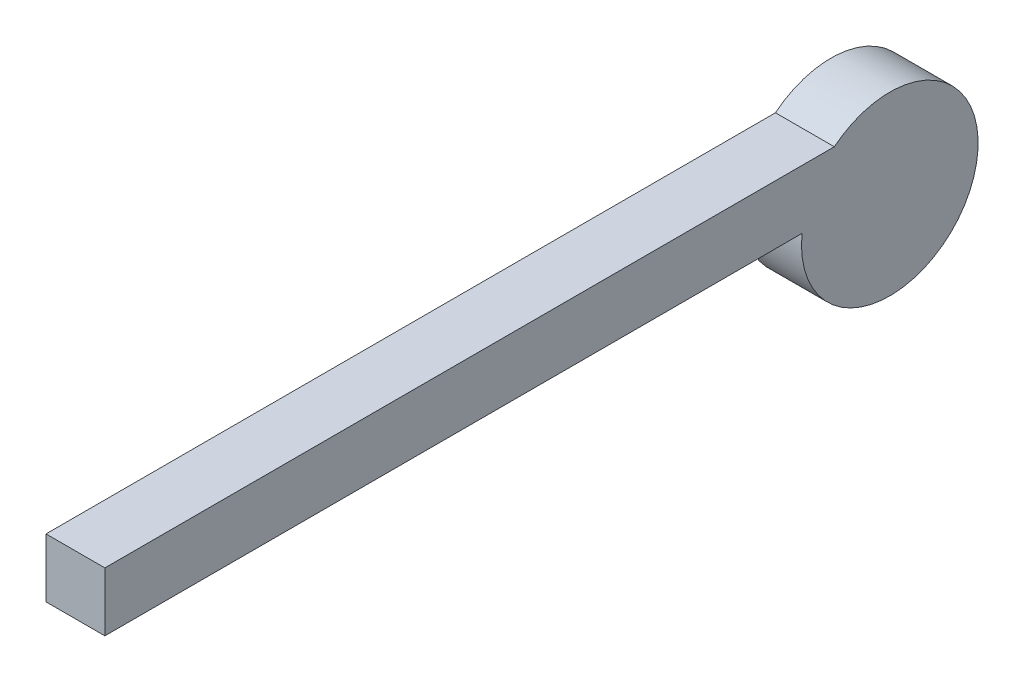
ISO-10303-21;
HEADER;
FILE_DESCRIPTION(('STEP AP214'),'2;1');
FILE_NAME('part.step','',(''),(''),'','','');
FILE_SCHEMA(('AUTOMOTIVE_DESIGN { 1 0 10303 214 1 1 1 1 }'));
ENDSEC;
DATA;
#1=APPLICATION_CONTEXT('core data for automotive mechanical design processes');
#2=APPLICATION_PROTOCOL_DEFINITION('international standard','automotive_design',2000,#1);
#3=PRODUCT_CONTEXT('',#1,'mechanical');
#4=PRODUCT('Part','Part','',(#3));
#5=PRODUCT_RELATED_PRODUCT_CATEGORY('part','',(#4));
#6=PRODUCT_DEFINITION_FORMATION('','',#4);
#7=PRODUCT_DEFINITION_CONTEXT('part definition',#1,'design');
#8=PRODUCT_DEFINITION('design','',#6,#7);
#9=PRODUCT_DEFINITION_SHAPE('','',#8);
#10=(LENGTH_UNIT() NAMED_UNIT(*) SI_UNIT(.MILLI.,.METRE.));
#11=(NAMED_UNIT(*) PLANE_ANGLE_UNIT() SI_UNIT($,.RADIAN.));
#12=(NAMED_UNIT(*) SI_UNIT($,.STERADIAN.) SOLID_ANGLE_UNIT());
#13=UNCERTAINTY_MEASURE_WITH_UNIT(LENGTH_MEASURE(1.E-05),#10,'distance_accuracy_value','');
#14=(GEOMETRIC_REPRESENTATION_CONTEXT(3) GLOBAL_UNCERTAINTY_ASSIGNED_CONTEXT((#13)) GLOBAL_UNIT_ASSIGNED_CONTEXT((#10,
#11,#12)) REPRESENTATION_CONTEXT('',''));
#15=CARTESIAN_POINT('',(0.,0.,0.));
#16=DIRECTION('',(0.,0.,1.));
#17=DIRECTION('',(1.,0.,0.));
#18=AXIS2_PLACEMENT_3D('',#15,#16,#17);
#19=CARTESIAN_POINT('',(15.,0.,0.));
#20=DIRECTION('',(-1.,0.,0.));
#21=DIRECTION('',(0.,0.,1.));
#22=AXIS2_PLACEMENT_3D('',#19,#20,#21);
#23=CYLINDRICAL_SURFACE('',#22,45.);
#24=CARTESIAN_POINT('',(-15.,0.,0.));
#25=DIRECTION('',(1.,0.,0.));
#26=DIRECTION('',(0.,0.,-1.));
#27=AXIS2_PLACEMENT_3D('',#24,#25,#26);
#28=CIRCLE('',#27,45.);
#29=CARTESIAN_POINT('',(-15.,4.99999999999999,44.7213595499958));
#30=VERTEX_POINT('',#29);
#31=CARTESIAN_POINT('',(-15.,35.,28.2842712474619));
#32=VERTEX_POINT('',#31);
#33=EDGE_CURVE('E109',#30,#32,#28,.T.);
#34=ORIENTED_EDGE('',*,*,#33,.T.);
#35=DIRECTION('',(-1.,0.,0.));
#36=VECTOR('',#35,1.);
#37=CARTESIAN_POINT('',(15.,35.,28.2842712474619));
#38=LINE('',#37,#36);
#39=CARTESIAN_POINT('',(15.,35.,28.2842712474619));
#40=VERTEX_POINT('',#39);
#41=EDGE_CURVE('E11',#40,#32,#38,.T.);
#42=ORIENTED_EDGE('',*,*,#41,.F.);
#43=CARTESIAN_POINT('',(15.,0.,0.));
#44=DIRECTION('',(1.,0.,0.));
#45=DIRECTION('',(0.,0.,-1.));
#46=AXIS2_PLACEMENT_3D('',#43,#44,#45);
#47=CIRCLE('',#46,45.);
#48=CARTESIAN_POINT('',(15.,4.99999999999999,44.7213595499958));
#49=VERTEX_POINT('',#48);
#50=EDGE_CURVE('E91',#49,#40,#47,.T.);
#51=ORIENTED_EDGE('',*,*,#50,.F.);
#52=DIRECTION('',(-1.,0.,0.));
#53=VECTOR('',#52,1.);
#54=CARTESIAN_POINT('',(15.,4.99999999999999,44.7213595499958));
#55=LINE('',#54,#53);
#56=EDGE_CURVE('E58',#49,#30,#55,.T.);
#57=ORIENTED_EDGE('',*,*,#56,.T.);
#58=EDGE_LOOP('',(#34,#42,#51,#57));
#59=FACE_BOUND('',#58,.T.);
#60=ADVANCED_FACE('F41',(#59),#23,.T.);
#61=CARTESIAN_POINT('',(15.,35.,0.));
#62=DIRECTION('',(0.,-1.,0.));
#63=DIRECTION('',(0.,0.,-1.));
#64=AXIS2_PLACEMENT_3D('',#61,#62,#63);
#65=PLANE('',#64);
#66=DIRECTION('',(0.,0.,1.));
#67=VECTOR('',#66,1.);
#68=CARTESIAN_POINT('',(-15.,35.,0.));
#69=LINE('',#68,#67);
#70=CARTESIAN_POINT('',(-15.,35.,400.));
#71=VERTEX_POINT('',#70);
#72=EDGE_CURVE('E97',#32,#71,#69,.T.);
#73=ORIENTED_EDGE('',*,*,#72,.T.);
#74=DIRECTION('',(-1.,0.,0.));
#75=VECTOR('',#74,1.);
#76=CARTESIAN_POINT('',(15.,35.,400.));
#77=LINE('',#76,#75);
#78=CARTESIAN_POINT('',(15.,35.,400.));
#79=VERTEX_POINT('',#78);
#80=EDGE_CURVE('E50',#79,#71,#77,.T.);
#81=ORIENTED_EDGE('',*,*,#80,.F.);
#82=DIRECTION('',(0.,0.,1.));
#83=VECTOR('',#82,1.);
#84=CARTESIAN_POINT('',(15.,35.,0.));
#85=LINE('',#84,#83);
#86=EDGE_CURVE('E83',#40,#79,#85,.T.);
#87=ORIENTED_EDGE('',*,*,#86,.F.);
#88=ORIENTED_EDGE('',*,*,#41,.T.);
#89=EDGE_LOOP('',(#73,#81,#87,#88));
#90=FACE_BOUND('',#89,.T.);
#91=ADVANCED_FACE('F96',(#90),#65,.F.);
#92=CARTESIAN_POINT('',(15.,0.,400.));
#93=DIRECTION('',(0.,0.,1.));
#94=DIRECTION('',(1.,0.,0.));
#95=AXIS2_PLACEMENT_3D('',#92,#93,#94);
#96=PLANE('',#95);
#97=DIRECTION('',(0.,1.,0.));
#98=VECTOR('',#97,1.);
#99=CARTESIAN_POINT('',(-15.,0.,400.));
#100=LINE('',#99,#98);
#101=CARTESIAN_POINT('',(-15.,4.99999999999995,400.));
#102=VERTEX_POINT('',#101);
#103=EDGE_CURVE('E114',#102,#71,#100,.T.);
#104=ORIENTED_EDGE('',*,*,#103,.F.);
#105=DIRECTION('',(-1.,0.,0.));
#106=VECTOR('',#105,1.);
#107=CARTESIAN_POINT('',(15.,4.99999999999995,400.));
#108=LINE('',#107,#106);
#109=CARTESIAN_POINT('',(15.,4.99999999999995,400.));
#110=VERTEX_POINT('',#109);
#111=EDGE_CURVE('E72',#110,#102,#108,.T.);
#112=ORIENTED_EDGE('',*,*,#111,.F.);
#113=DIRECTION('',(0.,1.,0.));
#114=VECTOR('',#113,1.);
#115=CARTESIAN_POINT('',(15.,0.,400.));
#116=LINE('',#115,#114);
#117=EDGE_CURVE('E90',#110,#79,#116,.T.);
#118=ORIENTED_EDGE('',*,*,#117,.T.);
#119=ORIENTED_EDGE('',*,*,#80,.T.);
#120=EDGE_LOOP('',(#104,#112,#118,#119));
#121=FACE_BOUND('',#120,.T.);
#122=ADVANCED_FACE('F101',(#121),#96,.T.);
#123=CARTESIAN_POINT('',(15.,5.,0.));
#124=DIRECTION('',(0.,-1.,0.));
#125=DIRECTION('',(0.,0.,-1.));
#126=AXIS2_PLACEMENT_3D('',#123,#124,#125);
#127=PLANE('',#126);
#128=DIRECTION('',(0.,0.,1.));
#129=VECTOR('',#128,1.);
#130=CARTESIAN_POINT('',(-15.,5.,0.));
#131=LINE('',#130,#129);
#132=EDGE_CURVE('E117',#30,#102,#131,.T.);
#133=ORIENTED_EDGE('',*,*,#132,.F.);
#134=ORIENTED_EDGE('',*,*,#56,.F.);
#135=DIRECTION('',(0.,0.,1.));
#136=VECTOR('',#135,1.);
#137=CARTESIAN_POINT('',(15.,5.,0.));
#138=LINE('',#137,#136);
#139=EDGE_CURVE('E103',#49,#110,#138,.T.);
#140=ORIENTED_EDGE('',*,*,#139,.T.);
#141=ORIENTED_EDGE('',*,*,#111,.T.);
#142=EDGE_LOOP('',(#133,#134,#140,#141));
#143=FACE_BOUND('',#142,.T.);
#144=ADVANCED_FACE('F127',(#143),#127,.T.);
#145=CARTESIAN_POINT('',(15.,0.,0.));
#146=DIRECTION('',(1.,0.,0.));
#147=DIRECTION('',(0.,0.,-1.));
#148=AXIS2_PLACEMENT_3D('',#145,#146,#147);
#149=PLANE('',#148);
#150=ORIENTED_EDGE('',*,*,#50,.T.);
#151=ORIENTED_EDGE('',*,*,#86,.T.);
#152=ORIENTED_EDGE('',*,*,#117,.F.);
#153=ORIENTED_EDGE('',*,*,#139,.F.);
#154=EDGE_LOOP('',(#150,#151,#152,#153));
#155=FACE_BOUND('',#154,.T.);
#156=ADVANCED_FACE('F87',(#155),#149,.T.);
#157=CARTESIAN_POINT('',(-15.,0.,0.));
#158=DIRECTION('',(1.,0.,0.));
#159=DIRECTION('',(0.,0.,-1.));
#160=AXIS2_PLACEMENT_3D('',#157,#158,#159);
#161=PLANE('',#160);
#162=ORIENTED_EDGE('',*,*,#33,.F.);
#163=ORIENTED_EDGE('',*,*,#132,.T.);
#164=ORIENTED_EDGE('',*,*,#103,.T.);
#165=ORIENTED_EDGE('',*,*,#72,.F.);
#166=EDGE_LOOP('',(#162,#163,#164,#165));
#167=FACE_BOUND('',#166,.T.);
#168=ADVANCED_FACE('F126',(#167),#161,.F.);
#169=CLOSED_SHELL('',(#60,#91,#122,#144,#156,#168));
#170=MANIFOLD_SOLID_BREP('B2',#169);
#171=ADVANCED_BREP_SHAPE_REPRESENTATION('',(#18,#170),#14);
#172=SHAPE_DEFINITION_REPRESENTATION(#9,#171);
ENDSEC;
END-ISO-10303-21;
